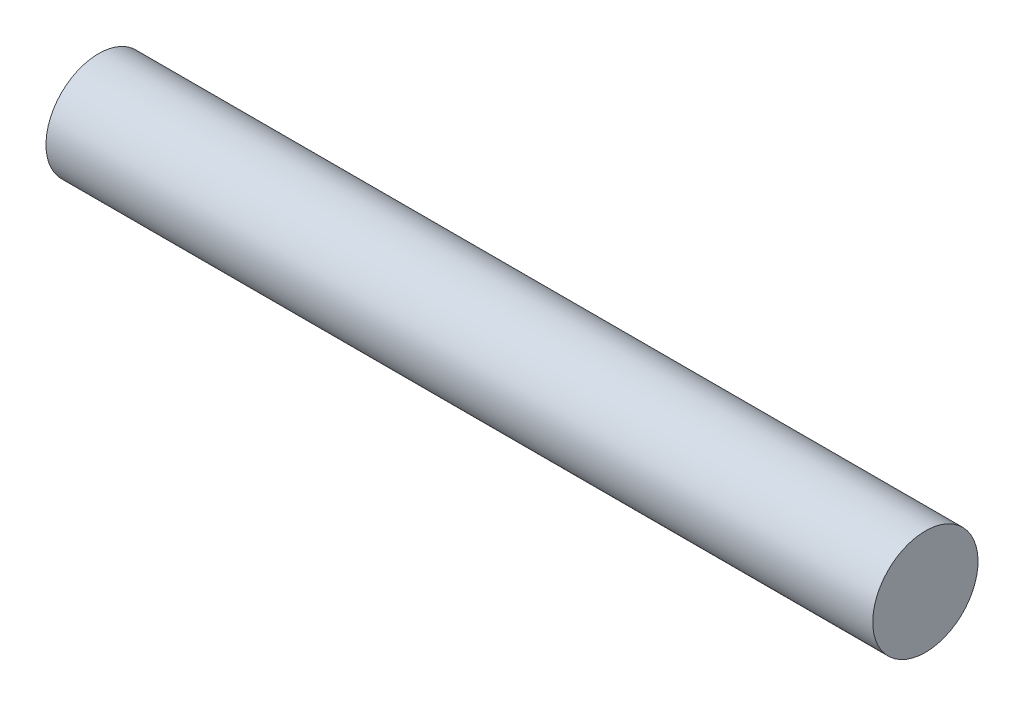
ISO-10303-21;
HEADER;
FILE_DESCRIPTION(('STEP AP214'),'2;1');
FILE_NAME('part.step','',(''),(''),'','','');
FILE_SCHEMA(('AUTOMOTIVE_DESIGN { 1 0 10303 214 1 1 1 1 }'));
ENDSEC;
DATA;
#1=APPLICATION_CONTEXT('core data for automotive mechanical design processes');
#2=APPLICATION_PROTOCOL_DEFINITION('international standard','automotive_design',2000,#1);
#3=PRODUCT_CONTEXT('',#1,'mechanical');
#4=PRODUCT('Part','Part','',(#3));
#5=PRODUCT_RELATED_PRODUCT_CATEGORY('part','',(#4));
#6=PRODUCT_DEFINITION_FORMATION('','',#4);
#7=PRODUCT_DEFINITION_CONTEXT('part definition',#1,'design');
#8=PRODUCT_DEFINITION('design','',#6,#7);
#9=PRODUCT_DEFINITION_SHAPE('','',#8);
#10=(LENGTH_UNIT() NAMED_UNIT(*) SI_UNIT(.MILLI.,.METRE.));
#11=(NAMED_UNIT(*) PLANE_ANGLE_UNIT() SI_UNIT($,.RADIAN.));
#12=(NAMED_UNIT(*) SI_UNIT($,.STERADIAN.) SOLID_ANGLE_UNIT());
#13=UNCERTAINTY_MEASURE_WITH_UNIT(LENGTH_MEASURE(1.E-05),#10,'distance_accuracy_value','');
#14=(GEOMETRIC_REPRESENTATION_CONTEXT(3) GLOBAL_UNCERTAINTY_ASSIGNED_CONTEXT((#13)) GLOBAL_UNIT_ASSIGNED_CONTEXT((#10,
#11,#12)) REPRESENTATION_CONTEXT('',''));
#15=CARTESIAN_POINT('',(0.,0.,0.));
#16=DIRECTION('',(0.,0.,1.));
#17=DIRECTION('',(1.,0.,0.));
#18=AXIS2_PLACEMENT_3D('',#15,#16,#17);
#19=CARTESIAN_POINT('',(0.,0.,0.));
#20=DIRECTION('',(1.,0.,0.));
#21=DIRECTION('',(0.,0.,-1.));
#22=AXIS2_PLACEMENT_3D('',#19,#20,#21);
#23=PLANE('',#22);
#24=CARTESIAN_POINT('',(0.,0.,0.));
#25=DIRECTION('',(1.,0.,0.));
#26=DIRECTION('',(0.,0.,-1.));
#27=AXIS2_PLACEMENT_3D('',#24,#25,#26);
#28=CIRCLE('',#27,3.57);
#29=CARTESIAN_POINT('',(0.,0.,-3.57));
#30=VERTEX_POINT('',#29);
#31=EDGE_CURVE('E42',#30,#30,#28,.T.);
#32=ORIENTED_EDGE('',*,*,#31,.F.);
#33=EDGE_LOOP('',(#32));
#34=FACE_BOUND('',#33,.T.);
#35=ADVANCED_FACE('F35',(#34),#23,.F.);
#36=CARTESIAN_POINT('',(66.1744605938849,0.,0.));
#37=DIRECTION('',(-1.,0.,0.));
#38=DIRECTION('',(0.,0.,1.));
#39=AXIS2_PLACEMENT_3D('',#36,#37,#38);
#40=CYLINDRICAL_SURFACE('',#39,3.57);
#41=CARTESIAN_POINT('',(56.076975758541,0.,0.));
#42=DIRECTION('',(-1.,0.,0.));
#43=DIRECTION('',(0.,-1.,0.));
#44=AXIS2_PLACEMENT_3D('',#41,#42,#43);
#45=CIRCLE('',#44,3.57);
#46=CARTESIAN_POINT('',(56.076975758541,-3.57,0.));
#47=VERTEX_POINT('',#46);
#48=EDGE_CURVE('E10',#47,#47,#45,.T.);
#49=ORIENTED_EDGE('',*,*,#48,.T.);
#50=EDGE_LOOP('',(#49));
#51=FACE_BOUND('',#50,.T.);
#52=ORIENTED_EDGE('',*,*,#31,.T.);
#53=EDGE_LOOP('',(#52));
#54=FACE_BOUND('',#53,.T.);
#55=ADVANCED_FACE('F37',(#51,#54),#40,.T.);
#56=CARTESIAN_POINT('',(56.076975758541,-3.571874999998,-8.60421247631208E-13));
#57=DIRECTION('',(-1.,0.,0.));
#58=DIRECTION('',(0.,0.,-1.));
#59=AXIS2_PLACEMENT_3D('',#56,#57,#58);
#60=PLANE('',#59);
#61=ORIENTED_EDGE('',*,*,#48,.F.);
#62=EDGE_LOOP('',(#61));
#63=FACE_BOUND('',#62,.T.);
#64=ADVANCED_FACE('F53',(#63),#60,.F.);
#65=CLOSED_SHELL('',(#35,#55,#64));
#66=MANIFOLD_SOLID_BREP('B2',#65);
#67=ADVANCED_BREP_SHAPE_REPRESENTATION('',(#18,#66),#14);
#68=SHAPE_DEFINITION_REPRESENTATION(#9,#67);
ENDSEC;
END-ISO-10303-21;
